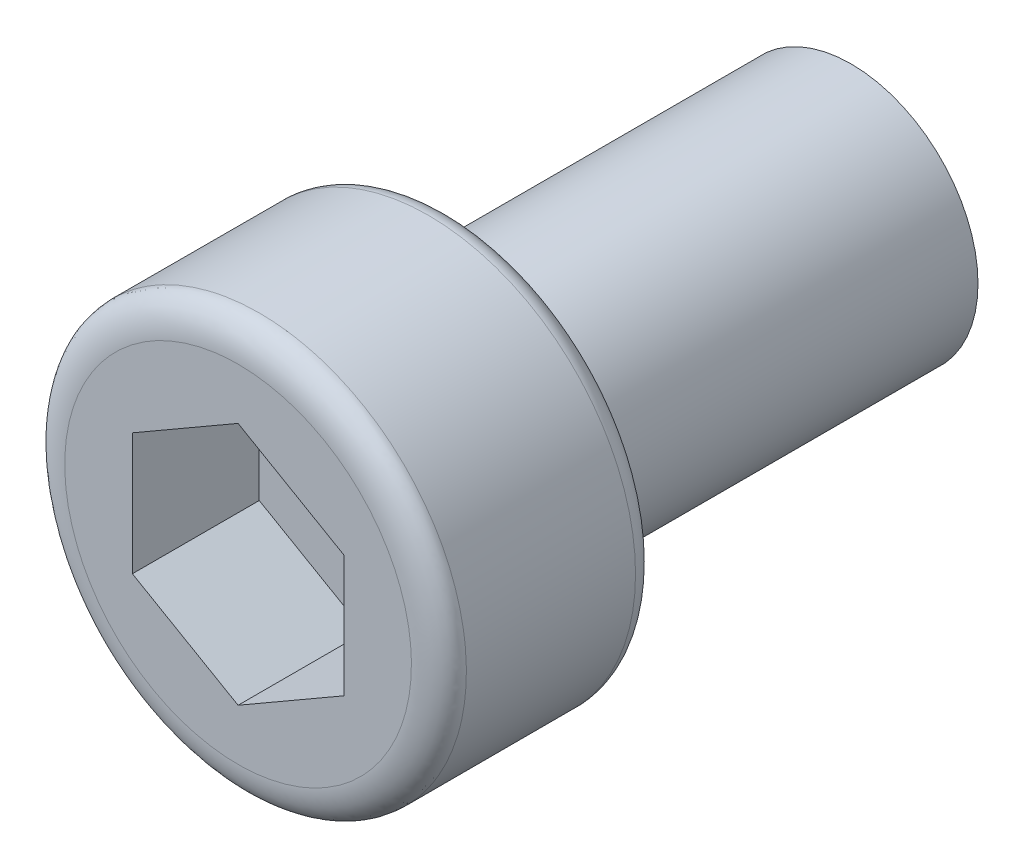
ISO-10303-21;
HEADER;
FILE_DESCRIPTION(('STEP AP214'),'2;1');
FILE_NAME('part.step','',(''),(''),'','','');
FILE_SCHEMA(('AUTOMOTIVE_DESIGN { 1 0 10303 214 1 1 1 1 }'));
ENDSEC;
DATA;
#1=APPLICATION_CONTEXT('core data for automotive mechanical design processes');
#2=APPLICATION_PROTOCOL_DEFINITION('international standard','automotive_design',2000,#1);
#3=PRODUCT_CONTEXT('',#1,'mechanical');
#4=PRODUCT('Part','Part','',(#3));
#5=PRODUCT_RELATED_PRODUCT_CATEGORY('part','',(#4));
#6=PRODUCT_DEFINITION_FORMATION('','',#4);
#7=PRODUCT_DEFINITION_CONTEXT('part definition',#1,'design');
#8=PRODUCT_DEFINITION('design','',#6,#7);
#9=PRODUCT_DEFINITION_SHAPE('','',#8);
#10=(LENGTH_UNIT() NAMED_UNIT(*) SI_UNIT(.MILLI.,.METRE.));
#11=(NAMED_UNIT(*) PLANE_ANGLE_UNIT() SI_UNIT($,.RADIAN.));
#12=(NAMED_UNIT(*) SI_UNIT($,.STERADIAN.) SOLID_ANGLE_UNIT());
#13=UNCERTAINTY_MEASURE_WITH_UNIT(LENGTH_MEASURE(1.E-05),#10,'distance_accuracy_value','');
#14=(GEOMETRIC_REPRESENTATION_CONTEXT(3) GLOBAL_UNCERTAINTY_ASSIGNED_CONTEXT((#13)) GLOBAL_UNIT_ASSIGNED_CONTEXT((#10,
#11,#12)) REPRESENTATION_CONTEXT('',''));
#15=CARTESIAN_POINT('',(0.,0.,0.));
#16=DIRECTION('',(0.,0.,1.));
#17=DIRECTION('',(1.,0.,0.));
#18=AXIS2_PLACEMENT_3D('',#15,#16,#17);
#19=CARTESIAN_POINT('',(0.,0.,7.5));
#20=DIRECTION('',(0.,0.,1.));
#21=DIRECTION('',(0.,-1.,0.));
#22=AXIS2_PLACEMENT_3D('',#19,#20,#21);
#23=PLANE('',#22);
#24=DIRECTION('',(-0.866025403784439,0.5,0.));
#25=VECTOR('',#24,1.);
#26=CARTESIAN_POINT('',(2.5,1.44337567297407,7.5));
#27=LINE('',#26,#25);
#28=CARTESIAN_POINT('',(2.5,1.44337567297407,7.5));
#29=VERTEX_POINT('',#28);
#30=CARTESIAN_POINT('',(0.,2.88675134594813,7.5));
#31=VERTEX_POINT('',#30);
#32=EDGE_CURVE('E56',#29,#31,#27,.T.);
#33=ORIENTED_EDGE('',*,*,#32,.F.);
#34=DIRECTION('',(0.,1.,0.));
#35=VECTOR('',#34,1.);
#36=CARTESIAN_POINT('',(2.5,-1.44337567297407,7.5));
#37=LINE('',#36,#35);
#38=CARTESIAN_POINT('',(2.5,-1.44337567297407,7.5));
#39=VERTEX_POINT('',#38);
#40=EDGE_CURVE('E139',#39,#29,#37,.T.);
#41=ORIENTED_EDGE('',*,*,#40,.F.);
#42=DIRECTION('',(0.866025403784439,0.5,0.));
#43=VECTOR('',#42,1.);
#44=CARTESIAN_POINT('',(0.,-2.88675134594813,7.5));
#45=LINE('',#44,#43);
#46=CARTESIAN_POINT('',(0.,-2.88675134594813,7.5));
#47=VERTEX_POINT('',#46);
#48=EDGE_CURVE('E137',#47,#39,#45,.T.);
#49=ORIENTED_EDGE('',*,*,#48,.F.);
#50=DIRECTION('',(0.866025403784439,-0.5,0.));
#51=VECTOR('',#50,1.);
#52=CARTESIAN_POINT('',(-2.5,-1.44337567297406,7.5));
#53=LINE('',#52,#51);
#54=CARTESIAN_POINT('',(-2.5,-1.44337567297406,7.5));
#55=VERTEX_POINT('',#54);
#56=EDGE_CURVE('E104',#55,#47,#53,.T.);
#57=ORIENTED_EDGE('',*,*,#56,.F.);
#58=DIRECTION('',(0.,-1.,0.));
#59=VECTOR('',#58,1.);
#60=CARTESIAN_POINT('',(-2.5,1.44337567297407,7.5));
#61=LINE('',#60,#59);
#62=CARTESIAN_POINT('',(-2.5,1.44337567297407,7.5));
#63=VERTEX_POINT('',#62);
#64=EDGE_CURVE('E133',#63,#55,#61,.T.);
#65=ORIENTED_EDGE('',*,*,#64,.F.);
#66=DIRECTION('',(-0.866025403784439,-0.5,0.));
#67=VECTOR('',#66,1.);
#68=CARTESIAN_POINT('',(0.,2.88675134594813,7.5));
#69=LINE('',#68,#67);
#70=EDGE_CURVE('E130',#31,#63,#69,.T.);
#71=ORIENTED_EDGE('',*,*,#70,.F.);
#72=EDGE_LOOP('',(#33,#41,#49,#57,#65,#71));
#73=FACE_BOUND('',#72,.T.);
#74=CARTESIAN_POINT('',(0.,4.1,7.5));
#75=CARTESIAN_POINT('',(0.536688739667131,4.1,7.5));
#76=CARTESIAN_POINT('',(1.07316633078914,3.99328797230371,7.5));
#77=CARTESIAN_POINT('',(2.06483781460461,3.58252419428883,7.5));
#78=CARTESIAN_POINT('',(2.51964155565984,3.27863405006997,7.5));
#79=CARTESIAN_POINT('',(3.27863405006985,2.51964155565973,7.5));
#80=CARTESIAN_POINT('',(3.58252419428879,2.06483781460462,7.5));
#81=CARTESIAN_POINT('',(3.99328797230376,1.07316633078912,7.5));
#82=CARTESIAN_POINT('',(4.1,0.536688739667129,7.5));
#83=CARTESIAN_POINT('',(4.1,-0.536688739667132,7.5));
#84=CARTESIAN_POINT('',(3.99328797230365,-1.07316633078906,7.5));
#85=CARTESIAN_POINT('',(3.58252419428891,-2.06483781460468,7.5));
#86=CARTESIAN_POINT('',(3.27863405006997,-2.51964155565972,7.5));
#87=CARTESIAN_POINT('',(2.51964155565972,-3.27863405006997,7.5));
#88=CARTESIAN_POINT('',(2.06483781460456,-3.58252419428879,7.5));
#89=CARTESIAN_POINT('',(1.07316633078917,-3.99328797230376,7.5));
#90=CARTESIAN_POINT('',(0.536688739667156,-4.1,7.5));
#91=CARTESIAN_POINT('',(-0.536688739667156,-4.1,7.5));
#92=CARTESIAN_POINT('',(-1.07316633078958,-3.99328797230353,7.5));
#93=CARTESIAN_POINT('',(-2.06483781460415,-3.58252419428902,7.5));
#94=CARTESIAN_POINT('',(-2.51964155565937,-3.27863405007032,7.5));
#95=CARTESIAN_POINT('',(-3.27863405007032,-2.51964155565938,7.5));
#96=CARTESIAN_POINT('',(-3.58252419428902,-2.06483781460416,7.5));
#97=CARTESIAN_POINT('',(-3.99328797230353,-1.07316633078958,7.5));
#98=CARTESIAN_POINT('',(-4.1,-0.536688739667623,7.5));
#99=CARTESIAN_POINT('',(-4.1,0.536688739667615,7.5));
#100=CARTESIAN_POINT('',(-3.99328797230388,1.07316633078866,7.5));
#101=CARTESIAN_POINT('',(-3.58252419428867,2.06483781460509,7.5));
#102=CARTESIAN_POINT('',(-3.27863405006997,2.51964155565972,7.5));
#103=CARTESIAN_POINT('',(-2.51964155565973,3.27863405006996,7.5));
#104=CARTESIAN_POINT('',(-2.0648378146046,3.58252419428884,7.5));
#105=CARTESIAN_POINT('',(-1.07316633078913,3.99328797230372,7.5));
#106=CARTESIAN_POINT('',(-0.53668873966713,4.1,7.5));
#107=CARTESIAN_POINT('',(0.,4.1,7.5));
#108=(BOUNDED_CURVE() B_SPLINE_CURVE(3,(#74,#75,#76,#77,#78,#79,#80,#81,#82,#83,#84,#85,#86,#87,
#88,#89,#90,#91,#92,#93,#94,#95,#96,#97,#98,#99,#100,#101,#102,#103,#104,#105,#106,#107),
.UNSPECIFIED.,.T.,.F.) B_SPLINE_CURVE_WITH_KNOTS((4,2,2,2,2,2,2,2,2,2,2,2,2,2,2,2,4),
(-3.14159265358979,-2.74889357189107,-2.35619449019234,-1.96349540849362,-1.5707963267949,
-1.17809724509617,-0.785398163397448,-0.392699081698724,0.,0.392699081698724,0.785398163397448,
1.17809724509617,1.5707963267949,1.96349540849362,2.35619449019234,2.74889357189107,
3.14159265358979),
.UNSPECIFIED.) CURVE() GEOMETRIC_REPRESENTATION_ITEM() RATIONAL_B_SPLINE_CURVE((1.,1.,1.,1.,1.,
1.,1.,1.,1.,1.,1.,1.,1.,1.,1.,1.,1.,1.,1.,1.,1.,1.,1.,1.,1.,1.,1.,1.,1.,1.,1.,1.,1.,1.)) REPRESENTATION_ITEM(''));
#109=CARTESIAN_POINT('',(0.,4.1,7.5));
#110=VERTEX_POINT('',#109);
#111=EDGE_CURVE('E244',#110,#110,#108,.F.);
#112=ORIENTED_EDGE('',*,*,#111,.T.);
#113=EDGE_LOOP('',(#112));
#114=FACE_BOUND('',#113,.T.);
#115=ADVANCED_FACE('F41',(#73,#114),#23,.T.);
#116=CARTESIAN_POINT('',(0.,0.,-7.5));
#117=DIRECTION('',(0.,0.,-1.));
#118=DIRECTION('',(0.,1.,0.));
#119=AXIS2_PLACEMENT_3D('',#116,#117,#118);
#120=CYLINDRICAL_SURFACE('',#119,4.9);
#121=CARTESIAN_POINT('',(0.,4.9,7.));
#122=CARTESIAN_POINT('',(-0.641408493748521,4.9,7.));
#123=CARTESIAN_POINT('',(-1.28256463923584,4.77246611324109,7.));
#124=CARTESIAN_POINT('',(-2.46773299794203,4.28155330536952,7.));
#125=CARTESIAN_POINT('',(-3.01127893237383,3.91836752325434,7.));
#126=CARTESIAN_POINT('',(-3.91836752325434,3.01127893237382,7.));
#127=CARTESIAN_POINT('',(-4.28155330536928,2.46773299794261,7.));
#128=CARTESIAN_POINT('',(-4.77246611324132,1.28256463923528,7.));
#129=CARTESIAN_POINT('',(-4.9,0.641408493749101,7.));
#130=CARTESIAN_POINT('',(-4.9,-0.64140849374911,7.));
#131=CARTESIAN_POINT('',(-4.77246611324086,-1.28256463923639,7.));
#132=CARTESIAN_POINT('',(-4.28155330536975,-2.4677329979415,7.));
#133=CARTESIAN_POINT('',(-3.91836752325474,-3.01127893237343,7.));
#134=CARTESIAN_POINT('',(-3.01127893237342,-3.91836752325474,7.));
#135=CARTESIAN_POINT('',(-2.4677329979415,-4.28155330536975,7.));
#136=CARTESIAN_POINT('',(-1.28256463923638,-4.77246611324087,7.));
#137=CARTESIAN_POINT('',(-0.641408493748553,-4.9,7.));
#138=CARTESIAN_POINT('',(0.641408493748553,-4.9,7.));
#139=CARTESIAN_POINT('',(1.28256463923582,-4.7724661132411,7.));
#140=CARTESIAN_POINT('',(2.46773299794206,-4.28155330536952,7.));
#141=CARTESIAN_POINT('',(3.01127893237383,-3.91836752325433,7.));
#142=CARTESIAN_POINT('',(3.91836752325433,-3.01127893237383,7.));
#143=CARTESIAN_POINT('',(4.28155330536951,-2.46773299794207,7.));
#144=CARTESIAN_POINT('',(4.77246611324111,-1.2825646392358,7.));
#145=CARTESIAN_POINT('',(4.9,-0.641408493748523,7.));
#146=CARTESIAN_POINT('',(4.9,0.64140849374852,7.));
#147=CARTESIAN_POINT('',(4.77246611324114,1.28256463923572,7.));
#148=CARTESIAN_POINT('',(4.28155330536947,2.46773299794216,7.));
#149=CARTESIAN_POINT('',(3.91836752325428,3.01127893237389,7.));
#150=CARTESIAN_POINT('',(3.01127893237388,3.91836752325428,7.));
#151=CARTESIAN_POINT('',(2.46773299794204,4.28155330536952,7.));
#152=CARTESIAN_POINT('',(1.28256463923585,4.77246611324109,7.));
#153=CARTESIAN_POINT('',(0.641408493748523,4.9,7.));
#154=CARTESIAN_POINT('',(0.,4.9,7.));
#155=(BOUNDED_CURVE() B_SPLINE_CURVE(3,(#121,#122,#123,#124,#125,#126,#127,#128,#129,#130,#131,
#132,#133,#134,#135,#136,#137,#138,#139,#140,#141,#142,#143,#144,#145,#146,#147,#148,#149,#150,
#151,#152,#153,#154),.UNSPECIFIED.,.T.,.F.) B_SPLINE_CURVE_WITH_KNOTS((4,2,2,2,2,2,2,2,2,2,2,2,
2,2,2,2,4),(-3.14159265358979,-2.74889357189107,-2.35619449019234,-1.96349540849362,
-1.5707963267949,-1.17809724509617,-0.785398163397448,-0.392699081698724,0.,0.392699081698724,
0.785398163397448,1.17809724509617,1.5707963267949,1.96349540849362,2.35619449019234,
2.74889357189107,3.14159265358979),
.UNSPECIFIED.) CURVE() GEOMETRIC_REPRESENTATION_ITEM() RATIONAL_B_SPLINE_CURVE((1.,1.,1.,1.,1.,
1.,1.,1.,1.,1.,1.,1.,1.,1.,1.,1.,1.,1.,1.,1.,1.,1.,1.,1.,1.,1.,1.,1.,1.,1.,1.,1.,1.,1.)) REPRESENTATION_ITEM(''));
#156=CARTESIAN_POINT('',(0.,4.9,7.));
#157=VERTEX_POINT('',#156);
#158=EDGE_CURVE('E157',#157,#157,#155,.F.);
#159=ORIENTED_EDGE('',*,*,#158,.T.);
#160=EDGE_LOOP('',(#159));
#161=FACE_BOUND('',#160,.T.);
#162=CARTESIAN_POINT('',(0.,0.,3.));
#163=DIRECTION('',(0.,0.,-1.));
#164=DIRECTION('',(0.,1.,0.));
#165=AXIS2_PLACEMENT_3D('',#162,#163,#164);
#166=CIRCLE('',#165,4.9);
#167=CARTESIAN_POINT('',(0.,4.9,3.));
#168=VERTEX_POINT('',#167);
#169=EDGE_CURVE('E154',#168,#168,#166,.F.);
#170=ORIENTED_EDGE('',*,*,#169,.T.);
#171=EDGE_LOOP('',(#170));
#172=FACE_BOUND('',#171,.T.);
#173=ADVANCED_FACE('F168',(#161,#172),#120,.T.);
#174=CARTESIAN_POINT('',(0.,4.9,2.5));
#175=DIRECTION('',(0.,0.,-1.));
#176=DIRECTION('',(0.,1.,0.));
#177=AXIS2_PLACEMENT_3D('',#174,#175,#176);
#178=PLANE('',#177);
#179=CARTESIAN_POINT('',(0.,0.,2.5));
#180=DIRECTION('',(0.,0.,-1.));
#181=DIRECTION('',(0.,1.,0.));
#182=AXIS2_PLACEMENT_3D('',#179,#180,#181);
#183=CIRCLE('',#182,4.4);
#184=CARTESIAN_POINT('',(0.,4.4,2.5));
#185=VERTEX_POINT('',#184);
#186=EDGE_CURVE('E151',#185,#185,#183,.T.);
#187=ORIENTED_EDGE('',*,*,#186,.T.);
#188=EDGE_LOOP('',(#187));
#189=FACE_BOUND('',#188,.T.);
#190=CARTESIAN_POINT('',(0.,0.,2.5));
#191=DIRECTION('',(0.,0.,-1.));
#192=DIRECTION('',(0.,1.,0.));
#193=AXIS2_PLACEMENT_3D('',#190,#191,#192);
#194=CIRCLE('',#193,3.);
#195=CARTESIAN_POINT('',(0.,3.,2.5));
#196=VERTEX_POINT('',#195);
#197=EDGE_CURVE('E143',#196,#196,#194,.T.);
#198=ORIENTED_EDGE('',*,*,#197,.F.);
#199=EDGE_LOOP('',(#198));
#200=FACE_BOUND('',#199,.T.);
#201=ADVANCED_FACE('F178',(#189,#200),#178,.T.);
#202=CARTESIAN_POINT('',(0.,0.,-7.5));
#203=DIRECTION('',(0.,0.,-1.));
#204=DIRECTION('',(0.,1.,0.));
#205=AXIS2_PLACEMENT_3D('',#202,#203,#204);
#206=CYLINDRICAL_SURFACE('',#205,3.);
#207=CARTESIAN_POINT('',(0.,0.,-7.));
#208=DIRECTION('',(0.,0.,-1.));
#209=DIRECTION('',(-1.,0.,0.));
#210=AXIS2_PLACEMENT_3D('',#207,#208,#209);
#211=CIRCLE('',#210,3.);
#212=CARTESIAN_POINT('',(-3.,0.,-7.));
#213=VERTEX_POINT('',#212);
#214=EDGE_CURVE('E12',#213,#213,#211,.F.);
#215=ORIENTED_EDGE('',*,*,#214,.T.);
#216=EDGE_LOOP('',(#215));
#217=FACE_BOUND('',#216,.T.);
#218=ORIENTED_EDGE('',*,*,#197,.T.);
#219=EDGE_LOOP('',(#218));
#220=FACE_BOUND('',#219,.T.);
#221=ADVANCED_FACE('F260',(#217,#220),#206,.T.);
#222=CARTESIAN_POINT('',(0.,3.,-7.5));
#223=DIRECTION('',(0.,0.,-1.));
#224=DIRECTION('',(0.,1.,0.));
#225=AXIS2_PLACEMENT_3D('',#222,#223,#224);
#226=PLANE('',#225);
#227=CARTESIAN_POINT('',(0.,0.,-7.5));
#228=DIRECTION('',(0.,0.,-1.));
#229=DIRECTION('',(0.,1.,0.));
#230=AXIS2_PLACEMENT_3D('',#227,#228,#229);
#231=CIRCLE('',#230,2.13397459621557);
#232=CARTESIAN_POINT('',(0.,2.13397459621557,-7.5));
#233=VERTEX_POINT('',#232);
#234=EDGE_CURVE('E49',#233,#233,#231,.T.);
#235=ORIENTED_EDGE('',*,*,#234,.T.);
#236=EDGE_LOOP('',(#235));
#237=FACE_BOUND('',#236,.T.);
#238=ADVANCED_FACE('F248',(#237),#226,.T.);
#239=CARTESIAN_POINT('',(0.,0.,3.));
#240=DIRECTION('',(0.,0.,-1.));
#241=DIRECTION('',(0.,1.,0.));
#242=AXIS2_PLACEMENT_3D('',#239,#240,#241);
#243=TOROIDAL_SURFACE('',#242,4.4,0.5);
#244=ORIENTED_EDGE('',*,*,#169,.F.);
#245=EDGE_LOOP('',(#244));
#246=FACE_BOUND('',#245,.T.);
#247=ORIENTED_EDGE('',*,*,#186,.F.);
#248=EDGE_LOOP('',(#247));
#249=FACE_BOUND('',#248,.T.);
#250=ADVANCED_FACE('F184',(#246,#249),#243,.T.);
#251=CARTESIAN_POINT('',(0.,4.1,7.5));
#252=CARTESIAN_POINT('',(-0.53668873966713,4.1,7.5));
#253=CARTESIAN_POINT('',(-1.07316633078913,3.99328797230372,7.5));
#254=CARTESIAN_POINT('',(-2.0648378146046,3.58252419428884,7.5));
#255=CARTESIAN_POINT('',(-2.51964155565973,3.27863405006996,7.5));
#256=CARTESIAN_POINT('',(-3.27863405006997,2.51964155565972,7.5));
#257=CARTESIAN_POINT('',(-3.58252419428867,2.06483781460509,7.5));
#258=CARTESIAN_POINT('',(-3.99328797230388,1.07316633078866,7.5));
#259=CARTESIAN_POINT('',(-4.1,0.536688739667615,7.5));
#260=CARTESIAN_POINT('',(-4.1,-0.536688739667623,7.5));
#261=CARTESIAN_POINT('',(-3.99328797230353,-1.07316633078958,7.5));
#262=CARTESIAN_POINT('',(-3.58252419428902,-2.06483781460416,7.5));
#263=CARTESIAN_POINT('',(-3.27863405007032,-2.51964155565938,7.5));
#264=CARTESIAN_POINT('',(-2.51964155565937,-3.27863405007032,7.5));
#265=CARTESIAN_POINT('',(-2.06483781460415,-3.58252419428902,7.5));
#266=CARTESIAN_POINT('',(-1.07316633078958,-3.99328797230353,7.5));
#267=CARTESIAN_POINT('',(-0.536688739667156,-4.1,7.5));
#268=CARTESIAN_POINT('',(0.536688739667156,-4.1,7.5));
#269=CARTESIAN_POINT('',(1.07316633078917,-3.99328797230376,7.5));
#270=CARTESIAN_POINT('',(2.06483781460456,-3.58252419428879,7.5));
#271=CARTESIAN_POINT('',(2.51964155565972,-3.27863405006997,7.5));
#272=CARTESIAN_POINT('',(3.27863405006997,-2.51964155565972,7.5));
#273=CARTESIAN_POINT('',(3.58252419428891,-2.06483781460468,7.5));
#274=CARTESIAN_POINT('',(3.99328797230365,-1.07316633078906,7.5));
#275=CARTESIAN_POINT('',(4.1,-0.536688739667132,7.5));
#276=CARTESIAN_POINT('',(4.1,0.536688739667129,7.5));
#277=CARTESIAN_POINT('',(3.99328797230376,1.07316633078912,7.5));
#278=CARTESIAN_POINT('',(3.58252419428879,2.06483781460462,7.5));
#279=CARTESIAN_POINT('',(3.27863405006985,2.51964155565973,7.5));
#280=CARTESIAN_POINT('',(2.51964155565984,3.27863405006997,7.5));
#281=CARTESIAN_POINT('',(2.06483781460461,3.58252419428883,7.5));
#282=CARTESIAN_POINT('',(1.07316633078914,3.99328797230371,7.5));
#283=CARTESIAN_POINT('',(0.536688739667131,4.1,7.5));
#284=CARTESIAN_POINT('',(0.,4.1,7.5));
#285=CARTESIAN_POINT('',(0.,4.9,7.5));
#286=CARTESIAN_POINT('',(-0.641408493748521,4.9,7.5));
#287=CARTESIAN_POINT('',(-1.28256463923585,4.77246611324098,7.5));
#288=CARTESIAN_POINT('',(-2.46773299794202,4.28155330536963,7.5));
#289=CARTESIAN_POINT('',(-3.01127893237377,3.91836752325439,7.49999999999977));
#290=CARTESIAN_POINT('',(-3.9183675232544,3.01127893237377,7.50000000000023));
#291=CARTESIAN_POINT('',(-4.28155330536938,2.46773299794265,7.5));
#292=CARTESIAN_POINT('',(-4.77246611324122,1.28256463923524,7.5));
#293=CARTESIAN_POINT('',(-4.9,0.641408493749101,7.5));
#294=CARTESIAN_POINT('',(-4.9,-0.64140849374911,7.5));
#295=CARTESIAN_POINT('',(-4.77246611324076,-1.28256463923628,7.49999999999977));
#296=CARTESIAN_POINT('',(-4.28155330536985,-2.4677329979416,7.50000000000023));
#297=CARTESIAN_POINT('',(-3.9183675232548,-3.01127893237349,7.49999999999977));
#298=CARTESIAN_POINT('',(-3.01127893237336,-3.91836752325469,7.50000000000023));
#299=CARTESIAN_POINT('',(-2.46773299794154,-4.28155330536985,7.5));
#300=CARTESIAN_POINT('',(-1.28256463923634,-4.77246611324076,7.5));
#301=CARTESIAN_POINT('',(-0.641408493748553,-4.9,7.5));
#302=CARTESIAN_POINT('',(0.641408493748553,-4.9,7.5));
#303=CARTESIAN_POINT('',(1.28256463923587,-4.77246611324123,7.5));
#304=CARTESIAN_POINT('',(2.46773299794201,-4.28155330536939,7.5));
#305=CARTESIAN_POINT('',(3.01127893237383,-3.91836752325433,7.50000000000023));
#306=CARTESIAN_POINT('',(3.91836752325433,-3.01127893237383,7.49999999999977));
#307=CARTESIAN_POINT('',(4.28155330536962,-2.46773299794218,7.50000000000023));
#308=CARTESIAN_POINT('',(4.77246611324099,-1.2825646392357,7.49999999999977));
#309=CARTESIAN_POINT('',(4.9,-0.641408493748523,7.5));
#310=CARTESIAN_POINT('',(4.9,0.64140849374852,7.5));
#311=CARTESIAN_POINT('',(4.77246611324122,1.28256463923576,7.5));
#312=CARTESIAN_POINT('',(4.28155330536939,2.46773299794212,7.5));
#313=CARTESIAN_POINT('',(3.91836752325416,3.01127893237377,7.5));
#314=CARTESIAN_POINT('',(3.011278932374,3.9183675232544,7.5));
#315=CARTESIAN_POINT('',(2.46773299794209,4.28155330536962,7.5));
#316=CARTESIAN_POINT('',(1.28256463923581,4.77246611324098,7.5));
#317=CARTESIAN_POINT('',(0.641408493748523,4.9,7.5));
#318=CARTESIAN_POINT('',(0.,4.9,7.5));
#319=CARTESIAN_POINT('',(0.,4.9,7.));
#320=CARTESIAN_POINT('',(-0.641408493748521,4.9,7.));
#321=CARTESIAN_POINT('',(-1.28256463923584,4.77246611324109,7.));
#322=CARTESIAN_POINT('',(-2.46773299794203,4.28155330536952,7.));
#323=CARTESIAN_POINT('',(-3.01127893237383,3.91836752325434,7.));
#324=CARTESIAN_POINT('',(-3.91836752325434,3.01127893237382,7.));
#325=CARTESIAN_POINT('',(-4.28155330536928,2.46773299794261,7.));
#326=CARTESIAN_POINT('',(-4.77246611324132,1.28256463923528,7.));
#327=CARTESIAN_POINT('',(-4.9,0.641408493749101,7.));
#328=CARTESIAN_POINT('',(-4.9,-0.64140849374911,7.));
#329=CARTESIAN_POINT('',(-4.77246611324086,-1.28256463923639,7.));
#330=CARTESIAN_POINT('',(-4.28155330536975,-2.4677329979415,7.));
#331=CARTESIAN_POINT('',(-3.91836752325474,-3.01127893237343,7.));
#332=CARTESIAN_POINT('',(-3.01127893237342,-3.91836752325474,7.));
#333=CARTESIAN_POINT('',(-2.4677329979415,-4.28155330536975,7.));
#334=CARTESIAN_POINT('',(-1.28256463923638,-4.77246611324087,7.));
#335=CARTESIAN_POINT('',(-0.641408493748553,-4.9,7.));
#336=CARTESIAN_POINT('',(0.641408493748553,-4.9,7.));
#337=CARTESIAN_POINT('',(1.28256463923582,-4.7724661132411,7.));
#338=CARTESIAN_POINT('',(2.46773299794206,-4.28155330536952,7.));
#339=CARTESIAN_POINT('',(3.01127893237383,-3.91836752325433,7.));
#340=CARTESIAN_POINT('',(3.91836752325433,-3.01127893237383,7.));
#341=CARTESIAN_POINT('',(4.28155330536951,-2.46773299794207,7.));
#342=CARTESIAN_POINT('',(4.77246611324111,-1.2825646392358,7.));
#343=CARTESIAN_POINT('',(4.9,-0.641408493748523,7.));
#344=CARTESIAN_POINT('',(4.9,0.64140849374852,7.));
#345=CARTESIAN_POINT('',(4.77246611324114,1.28256463923572,7.));
#346=CARTESIAN_POINT('',(4.28155330536947,2.46773299794216,7.));
#347=CARTESIAN_POINT('',(3.91836752325428,3.01127893237389,7.));
#348=CARTESIAN_POINT('',(3.01127893237388,3.91836752325428,7.));
#349=CARTESIAN_POINT('',(2.46773299794204,4.28155330536952,7.));
#350=CARTESIAN_POINT('',(1.28256463923585,4.77246611324109,7.));
#351=CARTESIAN_POINT('',(0.641408493748523,4.9,7.));
#352=CARTESIAN_POINT('',(0.,4.9,7.));
#353=(BOUNDED_SURFACE() B_SPLINE_SURFACE(2,3,((#251,#252,#253,#254,#255,#256,#257,#258,#259,
#260,#261,#262,#263,#264,#265,#266,#267,#268,#269,#270,#271,#272,#273,#274,#275,#276,#277,#278,
#279,#280,#281,#282,#283,#284),(#285,#286,#287,#288,#289,#290,#291,#292,#293,#294,#295,#296,
#297,#298,#299,#300,#301,#302,#303,#304,#305,#306,#307,#308,#309,#310,#311,#312,#313,#314,#315,
#316,#317,#318),(#319,#320,#321,#322,#323,#324,#325,#326,#327,#328,#329,#330,#331,#332,#333,
#334,#335,#336,#337,#338,#339,#340,#341,#342,#343,#344,#345,#346,#347,#348,#349,#350,#351,
#352)),.UNSPECIFIED.,.F.,.T.,.F.) B_SPLINE_SURFACE_WITH_KNOTS((3,3),(4,2,2,2,2,2,2,2,2,2,2,2,2,
2,2,2,4),(0.,1.),(-3.14159265358979,-2.74889357189107,-2.35619449019234,-1.96349540849362,
-1.5707963267949,-1.17809724509617,-0.785398163397448,-0.392699081698724,0.,0.392699081698724,
0.785398163397448,1.17809724509617,1.5707963267949,1.96349540849362,2.35619449019234,
2.74889357189107,3.14159265358979),
.UNSPECIFIED.) GEOMETRIC_REPRESENTATION_ITEM() RATIONAL_B_SPLINE_SURFACE(((1.,1.,1.,1.,1.,1.,1.,
1.,1.,1.,1.,1.,1.,1.,1.,1.,1.,1.,1.,1.,1.,1.,1.,1.,1.,1.,1.,1.,1.,1.,1.,1.,1.,1.),
(0.707106781186548,0.707106781186548,0.707106781186548,0.707106781186548,0.707106781186548,
0.707106781186548,0.707106781186548,0.707106781186548,0.707106781186548,0.707106781186548,
0.707106781186548,0.707106781186548,0.707106781186548,0.707106781186548,0.707106781186547,
0.707106781186547,0.707106781186548,0.707106781186548,0.707106781186548,0.707106781186548,
0.707106781186548,0.707106781186548,0.707106781186548,0.707106781186548,0.707106781186548,
0.707106781186548,0.707106781186548,0.707106781186548,0.707106781186548,0.707106781186548,
0.707106781186548,0.707106781186548,0.707106781186548,0.707106781186548),(1.,1.,1.,1.,1.,1.,1.,
1.,1.,1.,1.,1.,1.,1.,1.,1.,1.,1.,1.,1.,1.,1.,1.,1.,1.,1.,1.,1.,1.,1.,1.,1.,1.,1.))) REPRESENTATION_ITEM('') SURFACE());
#354=ORIENTED_EDGE('',*,*,#111,.F.);
#355=EDGE_LOOP('',(#354));
#356=FACE_BOUND('',#355,.T.);
#357=ORIENTED_EDGE('',*,*,#158,.F.);
#358=EDGE_LOOP('',(#357));
#359=FACE_BOUND('',#358,.T.);
#360=ADVANCED_FACE('F201',(#356,#359),#353,.T.);
#361=CARTESIAN_POINT('',(0.,0.,-7.5));
#362=DIRECTION('',(0.,0.,1.));
#363=DIRECTION('',(1.,0.,0.));
#364=AXIS2_PLACEMENT_3D('',#361,#362,#363);
#365=CONICAL_SURFACE('',#364,2.13397459621557,1.0471975511966);
#366=ORIENTED_EDGE('',*,*,#214,.F.);
#367=EDGE_LOOP('',(#366));
#368=FACE_BOUND('',#367,.T.);
#369=ORIENTED_EDGE('',*,*,#234,.F.);
#370=EDGE_LOOP('',(#369));
#371=FACE_BOUND('',#370,.T.);
#372=ADVANCED_FACE('F44',(#368,#371),#365,.T.);
#373=CARTESIAN_POINT('',(2.5,1.44337567297407,4.5));
#374=DIRECTION('',(0.5,0.866025403784438,0.));
#375=DIRECTION('',(-0.866025403784439,0.5,0.));
#376=AXIS2_PLACEMENT_3D('',#373,#374,#375);
#377=PLANE('',#376);
#378=ORIENTED_EDGE('',*,*,#32,.T.);
#379=DIRECTION('',(0.,0.,1.));
#380=VECTOR('',#379,1.);
#381=CARTESIAN_POINT('',(0.,2.88675134594813,4.5));
#382=LINE('',#381,#380);
#383=CARTESIAN_POINT('',(0.,2.88675134594813,4.5));
#384=VERTEX_POINT('',#383);
#385=EDGE_CURVE('E86',#384,#31,#382,.T.);
#386=ORIENTED_EDGE('',*,*,#385,.F.);
#387=DIRECTION('',(-0.866025403784439,0.5,0.));
#388=VECTOR('',#387,1.);
#389=CARTESIAN_POINT('',(2.5,1.44337567297407,4.5));
#390=LINE('',#389,#388);
#391=CARTESIAN_POINT('',(2.5,1.44337567297407,4.5));
#392=VERTEX_POINT('',#391);
#393=EDGE_CURVE('E141',#392,#384,#390,.T.);
#394=ORIENTED_EDGE('',*,*,#393,.F.);
#395=DIRECTION('',(0.,0.,1.));
#396=VECTOR('',#395,1.);
#397=CARTESIAN_POINT('',(2.5,1.44337567297407,4.5));
#398=LINE('',#397,#396);
#399=EDGE_CURVE('E64',#392,#29,#398,.T.);
#400=ORIENTED_EDGE('',*,*,#399,.T.);
#401=EDGE_LOOP('',(#378,#386,#394,#400));
#402=FACE_BOUND('',#401,.T.);
#403=ADVANCED_FACE('F251',(#402),#377,.F.);
#404=CARTESIAN_POINT('',(2.5,-1.44337567297407,4.5));
#405=DIRECTION('',(1.,0.,0.));
#406=DIRECTION('',(0.,1.,0.));
#407=AXIS2_PLACEMENT_3D('',#404,#405,#406);
#408=PLANE('',#407);
#409=ORIENTED_EDGE('',*,*,#40,.T.);
#410=ORIENTED_EDGE('',*,*,#399,.F.);
#411=DIRECTION('',(0.,1.,0.));
#412=VECTOR('',#411,1.);
#413=CARTESIAN_POINT('',(2.5,-1.44337567297407,4.5));
#414=LINE('',#413,#412);
#415=CARTESIAN_POINT('',(2.5,-1.44337567297407,4.5));
#416=VERTEX_POINT('',#415);
#417=EDGE_CURVE('E116',#416,#392,#414,.T.);
#418=ORIENTED_EDGE('',*,*,#417,.F.);
#419=DIRECTION('',(0.,0.,1.));
#420=VECTOR('',#419,1.);
#421=CARTESIAN_POINT('',(2.5,-1.44337567297407,4.5));
#422=LINE('',#421,#420);
#423=EDGE_CURVE('E108',#416,#39,#422,.T.);
#424=ORIENTED_EDGE('',*,*,#423,.T.);
#425=EDGE_LOOP('',(#409,#410,#418,#424));
#426=FACE_BOUND('',#425,.T.);
#427=ADVANCED_FACE('F256',(#426),#408,.F.);
#428=CARTESIAN_POINT('',(0.,-2.88675134594813,4.5));
#429=DIRECTION('',(0.5,-0.866025403784439,0.));
#430=DIRECTION('',(0.866025403784439,0.5,0.));
#431=AXIS2_PLACEMENT_3D('',#428,#429,#430);
#432=PLANE('',#431);
#433=ORIENTED_EDGE('',*,*,#48,.T.);
#434=ORIENTED_EDGE('',*,*,#423,.F.);
#435=DIRECTION('',(0.866025403784439,0.5,0.));
#436=VECTOR('',#435,1.);
#437=CARTESIAN_POINT('',(0.,-2.88675134594813,4.5));
#438=LINE('',#437,#436);
#439=CARTESIAN_POINT('',(0.,-2.88675134594813,4.5));
#440=VERTEX_POINT('',#439);
#441=EDGE_CURVE('E112',#440,#416,#438,.T.);
#442=ORIENTED_EDGE('',*,*,#441,.F.);
#443=DIRECTION('',(0.,0.,1.));
#444=VECTOR('',#443,1.);
#445=CARTESIAN_POINT('',(0.,-2.88675134594813,4.5));
#446=LINE('',#445,#444);
#447=EDGE_CURVE('E97',#440,#47,#446,.T.);
#448=ORIENTED_EDGE('',*,*,#447,.T.);
#449=EDGE_LOOP('',(#433,#434,#442,#448));
#450=FACE_BOUND('',#449,.T.);
#451=ADVANCED_FACE('F113',(#450),#432,.F.);
#452=CARTESIAN_POINT('',(-2.5,-1.44337567297406,4.5));
#453=DIRECTION('',(-0.5,-0.866025403784438,0.));
#454=DIRECTION('',(0.866025403784439,-0.5,0.));
#455=AXIS2_PLACEMENT_3D('',#452,#453,#454);
#456=PLANE('',#455);
#457=ORIENTED_EDGE('',*,*,#56,.T.);
#458=ORIENTED_EDGE('',*,*,#447,.F.);
#459=DIRECTION('',(0.866025403784439,-0.5,0.));
#460=VECTOR('',#459,1.);
#461=CARTESIAN_POINT('',(-2.5,-1.44337567297406,4.5));
#462=LINE('',#461,#460);
#463=CARTESIAN_POINT('',(-2.5,-1.44337567297406,4.5));
#464=VERTEX_POINT('',#463);
#465=EDGE_CURVE('E101',#464,#440,#462,.T.);
#466=ORIENTED_EDGE('',*,*,#465,.F.);
#467=DIRECTION('',(0.,0.,1.));
#468=VECTOR('',#467,1.);
#469=CARTESIAN_POINT('',(-2.5,-1.44337567297406,4.5));
#470=LINE('',#469,#468);
#471=EDGE_CURVE('E109',#464,#55,#470,.T.);
#472=ORIENTED_EDGE('',*,*,#471,.T.);
#473=EDGE_LOOP('',(#457,#458,#466,#472));
#474=FACE_BOUND('',#473,.T.);
#475=ADVANCED_FACE('F99',(#474),#456,.F.);
#476=CARTESIAN_POINT('',(-2.5,1.44337567297407,4.5));
#477=DIRECTION('',(-1.,0.,0.));
#478=DIRECTION('',(0.,0.,1.));
#479=AXIS2_PLACEMENT_3D('',#476,#477,#478);
#480=PLANE('',#479);
#481=ORIENTED_EDGE('',*,*,#64,.T.);
#482=ORIENTED_EDGE('',*,*,#471,.F.);
#483=DIRECTION('',(0.,-1.,0.));
#484=VECTOR('',#483,1.);
#485=CARTESIAN_POINT('',(-2.5,1.44337567297407,4.5));
#486=LINE('',#485,#484);
#487=CARTESIAN_POINT('',(-2.5,1.44337567297407,4.5));
#488=VERTEX_POINT('',#487);
#489=EDGE_CURVE('E122',#488,#464,#486,.T.);
#490=ORIENTED_EDGE('',*,*,#489,.F.);
#491=DIRECTION('',(0.,0.,1.));
#492=VECTOR('',#491,1.);
#493=CARTESIAN_POINT('',(-2.5,1.44337567297407,4.5));
#494=LINE('',#493,#492);
#495=EDGE_CURVE('E146',#488,#63,#494,.T.);
#496=ORIENTED_EDGE('',*,*,#495,.T.);
#497=EDGE_LOOP('',(#481,#482,#490,#496));
#498=FACE_BOUND('',#497,.T.);
#499=ADVANCED_FACE('F285',(#498),#480,.F.);
#500=CARTESIAN_POINT('',(0.,2.88675134594813,4.5));
#501=DIRECTION('',(-0.5,0.866025403784439,0.));
#502=DIRECTION('',(-0.866025403784439,-0.5,0.));
#503=AXIS2_PLACEMENT_3D('',#500,#501,#502);
#504=PLANE('',#503);
#505=ORIENTED_EDGE('',*,*,#70,.T.);
#506=ORIENTED_EDGE('',*,*,#495,.F.);
#507=DIRECTION('',(-0.866025403784439,-0.5,0.));
#508=VECTOR('',#507,1.);
#509=CARTESIAN_POINT('',(0.,2.88675134594813,4.5));
#510=LINE('',#509,#508);
#511=EDGE_CURVE('E124',#384,#488,#510,.T.);
#512=ORIENTED_EDGE('',*,*,#511,.F.);
#513=ORIENTED_EDGE('',*,*,#385,.T.);
#514=EDGE_LOOP('',(#505,#506,#512,#513));
#515=FACE_BOUND('',#514,.T.);
#516=ADVANCED_FACE('F282',(#515),#504,.F.);
#517=CARTESIAN_POINT('',(0.,0.,4.5));
#518=DIRECTION('',(0.,0.,1.));
#519=DIRECTION('',(1.,0.,0.));
#520=AXIS2_PLACEMENT_3D('',#517,#518,#519);
#521=PLANE('',#520);
#522=ORIENTED_EDGE('',*,*,#393,.T.);
#523=ORIENTED_EDGE('',*,*,#511,.T.);
#524=ORIENTED_EDGE('',*,*,#489,.T.);
#525=ORIENTED_EDGE('',*,*,#465,.T.);
#526=ORIENTED_EDGE('',*,*,#441,.T.);
#527=ORIENTED_EDGE('',*,*,#417,.T.);
#528=EDGE_LOOP('',(#522,#523,#524,#525,#526,#527));
#529=FACE_BOUND('',#528,.T.);
#530=ADVANCED_FACE('F119',(#529),#521,.T.);
#531=CLOSED_SHELL('',(#115,#173,#201,#221,#238,#250,#360,#372,#403,#427,#451,#475,#499,#516,#530));
#532=MANIFOLD_SOLID_BREP('B2',#531);
#533=ADVANCED_BREP_SHAPE_REPRESENTATION('',(#18,#532),#14);
#534=SHAPE_DEFINITION_REPRESENTATION(#9,#533);
ENDSEC;
END-ISO-10303-21;
